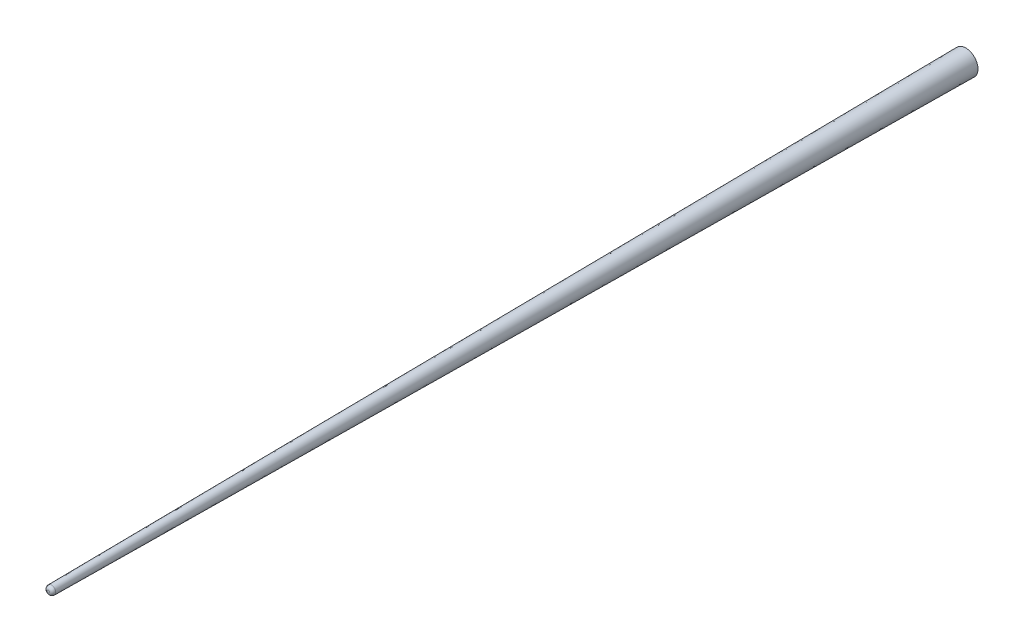
ISO-10303-21;
HEADER;
FILE_DESCRIPTION(('STEP AP214'),'2;1');
FILE_NAME('part.step','',(''),(''),'','','');
FILE_SCHEMA(('AUTOMOTIVE_DESIGN { 1 0 10303 214 1 1 1 1 }'));
ENDSEC;
DATA;
#1=APPLICATION_CONTEXT('core data for automotive mechanical design processes');
#2=APPLICATION_PROTOCOL_DEFINITION('international standard','automotive_design',2000,#1);
#3=PRODUCT_CONTEXT('',#1,'mechanical');
#4=PRODUCT('Part','Part','',(#3));
#5=PRODUCT_RELATED_PRODUCT_CATEGORY('part','',(#4));
#6=PRODUCT_DEFINITION_FORMATION('','',#4);
#7=PRODUCT_DEFINITION_CONTEXT('part definition',#1,'design');
#8=PRODUCT_DEFINITION('design','',#6,#7);
#9=PRODUCT_DEFINITION_SHAPE('','',#8);
#10=(LENGTH_UNIT() NAMED_UNIT(*) SI_UNIT(.MILLI.,.METRE.));
#11=(NAMED_UNIT(*) PLANE_ANGLE_UNIT() SI_UNIT($,.RADIAN.));
#12=(NAMED_UNIT(*) SI_UNIT($,.STERADIAN.) SOLID_ANGLE_UNIT());
#13=UNCERTAINTY_MEASURE_WITH_UNIT(LENGTH_MEASURE(1.E-05),#10,'distance_accuracy_value','');
#14=(GEOMETRIC_REPRESENTATION_CONTEXT(3) GLOBAL_UNCERTAINTY_ASSIGNED_CONTEXT((#13)) GLOBAL_UNIT_ASSIGNED_CONTEXT((#10,
#11,#12)) REPRESENTATION_CONTEXT('',''));
#15=CARTESIAN_POINT('',(0.,0.,0.));
#16=DIRECTION('',(0.,0.,1.));
#17=DIRECTION('',(1.,0.,0.));
#18=AXIS2_PLACEMENT_3D('',#15,#16,#17);
#19=CARTESIAN_POINT('',(0.,0.,0.));
#20=DIRECTION('',(0.,0.,-1.));
#21=DIRECTION('',(1.,0.,0.));
#22=AXIS2_PLACEMENT_3D('',#19,#20,#21);
#23=CONICAL_SURFACE('',#22,0.508,0.00872664625997167);
#24=CARTESIAN_POINT('',(0.,0.,37.9741082700083));
#25=DIRECTION('',(0.,0.,-1.));
#26=DIRECTION('',(-1.,0.,0.));
#27=AXIS2_PLACEMENT_3D('',#24,#25,#26);
#28=CIRCLE('',#27,0.176604977655677);
#29=CARTESIAN_POINT('',(-0.176604977655677,0.,37.9741082700083));
#30=VERTEX_POINT('',#29);
#31=EDGE_CURVE('E10',#30,#30,#28,.T.);
#32=ORIENTED_EDGE('',*,*,#31,.T.);
#33=EDGE_LOOP('',(#32));
#34=FACE_BOUND('',#33,.T.);
#35=CARTESIAN_POINT('',(0.,0.,0.));
#36=DIRECTION('',(0.,0.,1.));
#37=DIRECTION('',(1.,0.,0.));
#38=AXIS2_PLACEMENT_3D('',#35,#36,#37);
#39=CIRCLE('',#38,0.508);
#40=CARTESIAN_POINT('',(0.508,0.,0.));
#41=VERTEX_POINT('',#40);
#42=EDGE_CURVE('E54',#41,#41,#39,.T.);
#43=ORIENTED_EDGE('',*,*,#42,.T.);
#44=EDGE_LOOP('',(#43));
#45=FACE_BOUND('',#44,.T.);
#46=ADVANCED_FACE('F41',(#34,#45),#23,.T.);
#47=CARTESIAN_POINT('',(0.,0.,38.1));
#48=DIRECTION('',(0.,0.,1.));
#49=DIRECTION('',(1.,0.,0.));
#50=AXIS2_PLACEMENT_3D('',#47,#48,#49);
#51=PLANE('',#50);
#52=CARTESIAN_POINT('',(0.,0.,38.1));
#53=DIRECTION('',(0.,0.,1.));
#54=DIRECTION('',(1.,0.,0.));
#55=AXIS2_PLACEMENT_3D('',#52,#53,#54);
#56=CIRCLE('',#55,0.0496098134265272);
#57=CARTESIAN_POINT('',(0.0496098134265272,0.,38.1));
#58=VERTEX_POINT('',#57);
#59=EDGE_CURVE('E49',#58,#58,#56,.T.);
#60=ORIENTED_EDGE('',*,*,#59,.T.);
#61=EDGE_LOOP('',(#60));
#62=FACE_BOUND('',#61,.T.);
#63=ADVANCED_FACE('F65',(#62),#51,.T.);
#64=CARTESIAN_POINT('',(0.,0.,0.));
#65=DIRECTION('',(0.,0.,1.));
#66=DIRECTION('',(1.,0.,0.));
#67=AXIS2_PLACEMENT_3D('',#64,#65,#66);
#68=PLANE('',#67);
#69=ORIENTED_EDGE('',*,*,#42,.F.);
#70=EDGE_LOOP('',(#69));
#71=FACE_BOUND('',#70,.T.);
#72=ADVANCED_FACE('F63',(#71),#68,.F.);
#73=CARTESIAN_POINT('',(0.,0.,37.973));
#74=DIRECTION('',(0.,0.,1.));
#75=DIRECTION('',(1.,0.,0.));
#76=AXIS2_PLACEMENT_3D('',#73,#74,#75);
#77=DEGENERATE_TOROIDAL_SURFACE('',#76,0.0496098134265272,0.127,.T.);
#78=ORIENTED_EDGE('',*,*,#31,.F.);
#79=EDGE_LOOP('',(#78));
#80=FACE_BOUND('',#79,.T.);
#81=ORIENTED_EDGE('',*,*,#59,.F.);
#82=EDGE_LOOP('',(#81));
#83=FACE_BOUND('',#82,.T.);
#84=ADVANCED_FACE('F43',(#80,#83),#77,.T.);
#85=CLOSED_SHELL('',(#46,#63,#72,#84));
#86=MANIFOLD_SOLID_BREP('B2',#85);
#87=ADVANCED_BREP_SHAPE_REPRESENTATION('',(#18,#86),#14);
#88=SHAPE_DEFINITION_REPRESENTATION(#9,#87);
ENDSEC;
END-ISO-10303-21;
